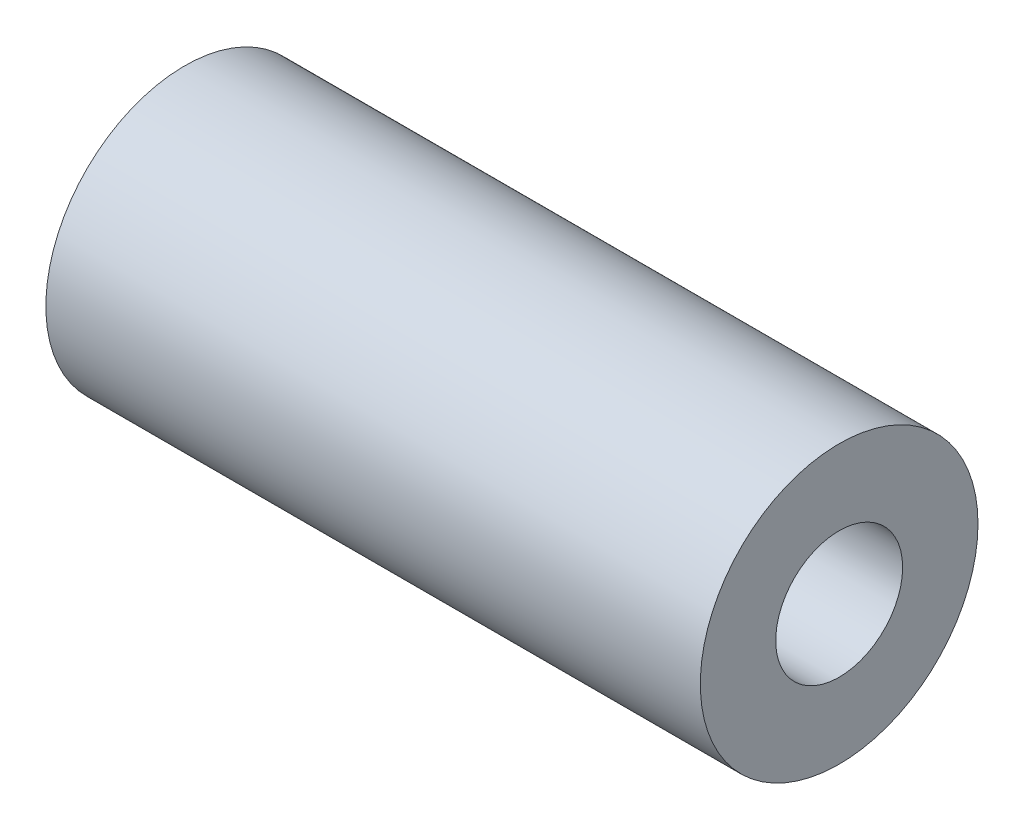
ISO-10303-21;
HEADER;
FILE_DESCRIPTION(('STEP AP214'),'2;1');
FILE_NAME('part.step','',(''),(''),'','','');
FILE_SCHEMA(('AUTOMOTIVE_DESIGN { 1 0 10303 214 1 1 1 1 }'));
ENDSEC;
DATA;
#1=APPLICATION_CONTEXT('core data for automotive mechanical design processes');
#2=APPLICATION_PROTOCOL_DEFINITION('international standard','automotive_design',2000,#1);
#3=PRODUCT_CONTEXT('',#1,'mechanical');
#4=PRODUCT('Part','Part','',(#3));
#5=PRODUCT_RELATED_PRODUCT_CATEGORY('part','',(#4));
#6=PRODUCT_DEFINITION_FORMATION('','',#4);
#7=PRODUCT_DEFINITION_CONTEXT('part definition',#1,'design');
#8=PRODUCT_DEFINITION('design','',#6,#7);
#9=PRODUCT_DEFINITION_SHAPE('','',#8);
#10=(LENGTH_UNIT() NAMED_UNIT(*) SI_UNIT(.MILLI.,.METRE.));
#11=(NAMED_UNIT(*) PLANE_ANGLE_UNIT() SI_UNIT($,.RADIAN.));
#12=(NAMED_UNIT(*) SI_UNIT($,.STERADIAN.) SOLID_ANGLE_UNIT());
#13=UNCERTAINTY_MEASURE_WITH_UNIT(LENGTH_MEASURE(1.E-05),#10,'distance_accuracy_value','');
#14=(GEOMETRIC_REPRESENTATION_CONTEXT(3) GLOBAL_UNCERTAINTY_ASSIGNED_CONTEXT((#13)) GLOBAL_UNIT_ASSIGNED_CONTEXT((#10,
#11,#12)) REPRESENTATION_CONTEXT('',''));
#15=CARTESIAN_POINT('',(0.,0.,0.));
#16=DIRECTION('',(0.,0.,1.));
#17=DIRECTION('',(1.,0.,0.));
#18=AXIS2_PLACEMENT_3D('',#15,#16,#17);
#19=CARTESIAN_POINT('',(16.5,0.,0.));
#20=DIRECTION('',(1.,0.,0.));
#21=DIRECTION('',(0.,0.,-1.));
#22=AXIS2_PLACEMENT_3D('',#19,#20,#21);
#23=PLANE('',#22);
#24=CARTESIAN_POINT('',(16.5,0.,0.));
#25=DIRECTION('',(1.,0.,0.));
#26=DIRECTION('',(0.,0.,-1.));
#27=AXIS2_PLACEMENT_3D('',#24,#25,#26);
#28=CIRCLE('',#27,3.5);
#29=CARTESIAN_POINT('',(16.5,0.,-3.5));
#30=VERTEX_POINT('',#29);
#31=EDGE_CURVE('E10',#30,#30,#28,.T.);
#32=ORIENTED_EDGE('',*,*,#31,.T.);
#33=EDGE_LOOP('',(#32));
#34=FACE_BOUND('',#33,.T.);
#35=CARTESIAN_POINT('',(16.5,0.,0.));
#36=DIRECTION('',(1.,0.,0.));
#37=DIRECTION('',(0.,0.,-1.));
#38=AXIS2_PLACEMENT_3D('',#35,#36,#37);
#39=CIRCLE('',#38,1.6);
#40=CARTESIAN_POINT('',(16.5,0.,-1.6));
#41=VERTEX_POINT('',#40);
#42=EDGE_CURVE('E44',#41,#41,#39,.T.);
#43=ORIENTED_EDGE('',*,*,#42,.F.);
#44=EDGE_LOOP('',(#43));
#45=FACE_BOUND('',#44,.T.);
#46=ADVANCED_FACE('F33',(#34,#45),#23,.T.);
#47=CARTESIAN_POINT('',(0.,0.,0.));
#48=DIRECTION('',(1.,0.,0.));
#49=DIRECTION('',(0.,0.,-1.));
#50=AXIS2_PLACEMENT_3D('',#47,#48,#49);
#51=PLANE('',#50);
#52=CARTESIAN_POINT('',(0.,0.,0.));
#53=DIRECTION('',(1.,0.,0.));
#54=DIRECTION('',(0.,0.,-1.));
#55=AXIS2_PLACEMENT_3D('',#52,#53,#54);
#56=CIRCLE('',#55,3.5);
#57=CARTESIAN_POINT('',(0.,0.,-3.5));
#58=VERTEX_POINT('',#57);
#59=EDGE_CURVE('E37',#58,#58,#56,.T.);
#60=ORIENTED_EDGE('',*,*,#59,.F.);
#61=EDGE_LOOP('',(#60));
#62=FACE_BOUND('',#61,.T.);
#63=CARTESIAN_POINT('',(0.,0.,0.));
#64=DIRECTION('',(1.,0.,0.));
#65=DIRECTION('',(0.,0.,-1.));
#66=AXIS2_PLACEMENT_3D('',#63,#64,#65);
#67=CIRCLE('',#66,1.6);
#68=CARTESIAN_POINT('',(0.,0.,-1.6));
#69=VERTEX_POINT('',#68);
#70=EDGE_CURVE('E46',#69,#69,#67,.T.);
#71=ORIENTED_EDGE('',*,*,#70,.T.);
#72=EDGE_LOOP('',(#71));
#73=FACE_BOUND('',#72,.T.);
#74=ADVANCED_FACE('F56',(#62,#73),#51,.F.);
#75=CARTESIAN_POINT('',(16.5,0.,0.));
#76=DIRECTION('',(-1.,0.,0.));
#77=DIRECTION('',(0.,0.,1.));
#78=AXIS2_PLACEMENT_3D('',#75,#76,#77);
#79=CYLINDRICAL_SURFACE('',#78,3.5);
#80=ORIENTED_EDGE('',*,*,#31,.F.);
#81=EDGE_LOOP('',(#80));
#82=FACE_BOUND('',#81,.T.);
#83=ORIENTED_EDGE('',*,*,#59,.T.);
#84=EDGE_LOOP('',(#83));
#85=FACE_BOUND('',#84,.T.);
#86=ADVANCED_FACE('F35',(#82,#85),#79,.T.);
#87=CARTESIAN_POINT('',(16.5,0.,0.));
#88=DIRECTION('',(-1.,0.,0.));
#89=DIRECTION('',(0.,0.,1.));
#90=AXIS2_PLACEMENT_3D('',#87,#88,#89);
#91=CYLINDRICAL_SURFACE('',#90,1.6);
#92=ORIENTED_EDGE('',*,*,#42,.T.);
#93=EDGE_LOOP('',(#92));
#94=FACE_BOUND('',#93,.T.);
#95=ORIENTED_EDGE('',*,*,#70,.F.);
#96=EDGE_LOOP('',(#95));
#97=FACE_BOUND('',#96,.T.);
#98=ADVANCED_FACE('F52',(#94,#97),#91,.F.);
#99=CLOSED_SHELL('',(#46,#74,#86,#98));
#100=MANIFOLD_SOLID_BREP('B2',#99);
#101=ADVANCED_BREP_SHAPE_REPRESENTATION('',(#18,#100),#14);
#102=SHAPE_DEFINITION_REPRESENTATION(#9,#101);
ENDSEC;
END-ISO-10303-21;
